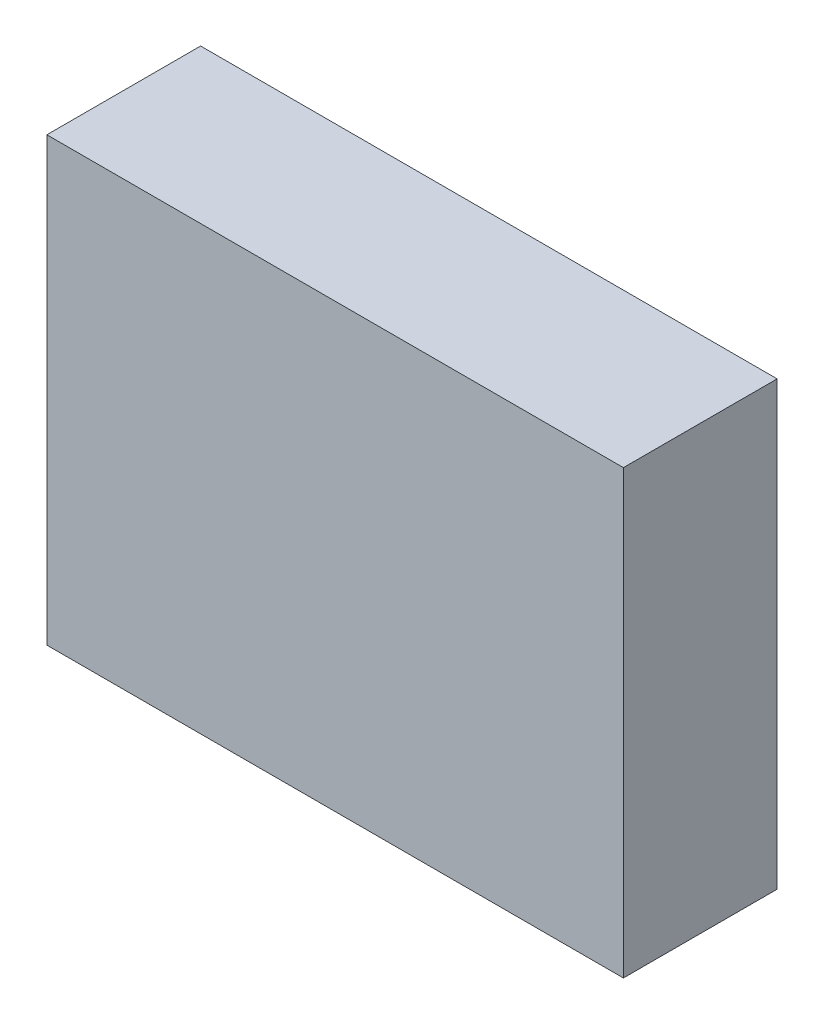
ISO-10303-21;
HEADER;
FILE_DESCRIPTION(('STEP AP214'),'2;1');
FILE_NAME('part.step','',(''),(''),'','','');
FILE_SCHEMA(('AUTOMOTIVE_DESIGN { 1 0 10303 214 1 1 1 1 }'));
ENDSEC;
DATA;
#1=APPLICATION_CONTEXT('core data for automotive mechanical design processes');
#2=APPLICATION_PROTOCOL_DEFINITION('international standard','automotive_design',2000,#1);
#3=PRODUCT_CONTEXT('',#1,'mechanical');
#4=PRODUCT('Part','Part','',(#3));
#5=PRODUCT_RELATED_PRODUCT_CATEGORY('part','',(#4));
#6=PRODUCT_DEFINITION_FORMATION('','',#4);
#7=PRODUCT_DEFINITION_CONTEXT('part definition',#1,'design');
#8=PRODUCT_DEFINITION('design','',#6,#7);
#9=PRODUCT_DEFINITION_SHAPE('','',#8);
#10=(LENGTH_UNIT() NAMED_UNIT(*) SI_UNIT(.MILLI.,.METRE.));
#11=(NAMED_UNIT(*) PLANE_ANGLE_UNIT() SI_UNIT($,.RADIAN.));
#12=(NAMED_UNIT(*) SI_UNIT($,.STERADIAN.) SOLID_ANGLE_UNIT());
#13=UNCERTAINTY_MEASURE_WITH_UNIT(LENGTH_MEASURE(1.E-05),#10,'distance_accuracy_value','');
#14=(GEOMETRIC_REPRESENTATION_CONTEXT(3) GLOBAL_UNCERTAINTY_ASSIGNED_CONTEXT((#13)) GLOBAL_UNIT_ASSIGNED_CONTEXT((#10,
#11,#12)) REPRESENTATION_CONTEXT('',''));
#15=CARTESIAN_POINT('',(0.,0.,0.));
#16=DIRECTION('',(0.,0.,1.));
#17=DIRECTION('',(1.,0.,0.));
#18=AXIS2_PLACEMENT_3D('',#15,#16,#17);
#19=CARTESIAN_POINT('',(0.,0.,80.));
#20=DIRECTION('',(1.,0.,0.));
#21=DIRECTION('',(0.,0.,-1.));
#22=AXIS2_PLACEMENT_3D('',#19,#20,#21);
#23=PLANE('',#22);
#24=DIRECTION('',(0.,-1.,0.));
#25=VECTOR('',#24,1.);
#26=CARTESIAN_POINT('',(0.,0.,0.));
#27=LINE('',#26,#25);
#28=CARTESIAN_POINT('',(0.,230.,0.));
#29=VERTEX_POINT('',#28);
#30=CARTESIAN_POINT('',(0.,0.,0.));
#31=VERTEX_POINT('',#30);
#32=EDGE_CURVE('E98',#29,#31,#27,.T.);
#33=ORIENTED_EDGE('',*,*,#32,.T.);
#34=DIRECTION('',(0.,0.,-1.));
#35=VECTOR('',#34,1.);
#36=CARTESIAN_POINT('',(0.,0.,80.));
#37=LINE('',#36,#35);
#38=CARTESIAN_POINT('',(0.,0.,80.));
#39=VERTEX_POINT('',#38);
#40=EDGE_CURVE('E11',#39,#31,#37,.T.);
#41=ORIENTED_EDGE('',*,*,#40,.F.);
#42=DIRECTION('',(0.,-1.,0.));
#43=VECTOR('',#42,1.);
#44=CARTESIAN_POINT('',(0.,0.,80.));
#45=LINE('',#44,#43);
#46=CARTESIAN_POINT('',(0.,230.,80.));
#47=VERTEX_POINT('',#46);
#48=EDGE_CURVE('E86',#47,#39,#45,.T.);
#49=ORIENTED_EDGE('',*,*,#48,.F.);
#50=DIRECTION('',(0.,0.,-1.));
#51=VECTOR('',#50,1.);
#52=CARTESIAN_POINT('',(0.,230.,80.));
#53=LINE('',#52,#51);
#54=EDGE_CURVE('E94',#47,#29,#53,.T.);
#55=ORIENTED_EDGE('',*,*,#54,.T.);
#56=EDGE_LOOP('',(#33,#41,#49,#55));
#57=FACE_BOUND('',#56,.T.);
#58=ADVANCED_FACE('F35',(#57),#23,.F.);
#59=CARTESIAN_POINT('',(0.,0.,80.));
#60=DIRECTION('',(0.,1.,0.));
#61=DIRECTION('',(0.,0.,1.));
#62=AXIS2_PLACEMENT_3D('',#59,#60,#61);
#63=PLANE('',#62);
#64=DIRECTION('',(1.,0.,0.));
#65=VECTOR('',#64,1.);
#66=CARTESIAN_POINT('',(0.,0.,0.));
#67=LINE('',#66,#65);
#68=CARTESIAN_POINT('',(300.,0.,0.));
#69=VERTEX_POINT('',#68);
#70=EDGE_CURVE('E90',#31,#69,#67,.T.);
#71=ORIENTED_EDGE('',*,*,#70,.T.);
#72=DIRECTION('',(0.,0.,-1.));
#73=VECTOR('',#72,1.);
#74=CARTESIAN_POINT('',(300.,0.,80.));
#75=LINE('',#74,#73);
#76=CARTESIAN_POINT('',(300.,0.,80.));
#77=VERTEX_POINT('',#76);
#78=EDGE_CURVE('E43',#77,#69,#75,.T.);
#79=ORIENTED_EDGE('',*,*,#78,.F.);
#80=DIRECTION('',(1.,0.,0.));
#81=VECTOR('',#80,1.);
#82=CARTESIAN_POINT('',(0.,0.,80.));
#83=LINE('',#82,#81);
#84=EDGE_CURVE('E81',#39,#77,#83,.T.);
#85=ORIENTED_EDGE('',*,*,#84,.F.);
#86=ORIENTED_EDGE('',*,*,#40,.T.);
#87=EDGE_LOOP('',(#71,#79,#85,#86));
#88=FACE_BOUND('',#87,.T.);
#89=ADVANCED_FACE('F89',(#88),#63,.F.);
#90=CARTESIAN_POINT('',(300.,0.,80.));
#91=DIRECTION('',(-1.,0.,0.));
#92=DIRECTION('',(0.,0.,1.));
#93=AXIS2_PLACEMENT_3D('',#90,#91,#92);
#94=PLANE('',#93);
#95=DIRECTION('',(0.,1.,0.));
#96=VECTOR('',#95,1.);
#97=CARTESIAN_POINT('',(300.,0.,0.));
#98=LINE('',#97,#96);
#99=CARTESIAN_POINT('',(300.,230.,0.));
#100=VERTEX_POINT('',#99);
#101=EDGE_CURVE('E68',#69,#100,#98,.T.);
#102=ORIENTED_EDGE('',*,*,#101,.T.);
#103=DIRECTION('',(0.,0.,-1.));
#104=VECTOR('',#103,1.);
#105=CARTESIAN_POINT('',(300.,230.,80.));
#106=LINE('',#105,#104);
#107=CARTESIAN_POINT('',(300.,230.,80.));
#108=VERTEX_POINT('',#107);
#109=EDGE_CURVE('E91',#108,#100,#106,.T.);
#110=ORIENTED_EDGE('',*,*,#109,.F.);
#111=DIRECTION('',(0.,1.,0.));
#112=VECTOR('',#111,1.);
#113=CARTESIAN_POINT('',(300.,0.,80.));
#114=LINE('',#113,#112);
#115=EDGE_CURVE('E84',#77,#108,#114,.T.);
#116=ORIENTED_EDGE('',*,*,#115,.F.);
#117=ORIENTED_EDGE('',*,*,#78,.T.);
#118=EDGE_LOOP('',(#102,#110,#116,#117));
#119=FACE_BOUND('',#118,.T.);
#120=ADVANCED_FACE('F92',(#119),#94,.F.);
#121=CARTESIAN_POINT('',(0.,230.,80.));
#122=DIRECTION('',(0.,-1.,0.));
#123=DIRECTION('',(0.,0.,-1.));
#124=AXIS2_PLACEMENT_3D('',#121,#122,#123);
#125=PLANE('',#124);
#126=DIRECTION('',(-1.,0.,0.));
#127=VECTOR('',#126,1.);
#128=CARTESIAN_POINT('',(0.,230.,0.));
#129=LINE('',#128,#127);
#130=EDGE_CURVE('E74',#100,#29,#129,.T.);
#131=ORIENTED_EDGE('',*,*,#130,.T.);
#132=ORIENTED_EDGE('',*,*,#54,.F.);
#133=DIRECTION('',(-1.,0.,0.));
#134=VECTOR('',#133,1.);
#135=CARTESIAN_POINT('',(0.,230.,80.));
#136=LINE('',#135,#134);
#137=EDGE_CURVE('E51',#108,#47,#136,.T.);
#138=ORIENTED_EDGE('',*,*,#137,.F.);
#139=ORIENTED_EDGE('',*,*,#109,.T.);
#140=EDGE_LOOP('',(#131,#132,#138,#139));
#141=FACE_BOUND('',#140,.T.);
#142=ADVANCED_FACE('F105',(#141),#125,.F.);
#143=CARTESIAN_POINT('',(0.,0.,80.));
#144=DIRECTION('',(0.,0.,-1.));
#145=DIRECTION('',(-1.,0.,0.));
#146=AXIS2_PLACEMENT_3D('',#143,#144,#145);
#147=PLANE('',#146);
#148=ORIENTED_EDGE('',*,*,#48,.T.);
#149=ORIENTED_EDGE('',*,*,#84,.T.);
#150=ORIENTED_EDGE('',*,*,#115,.T.);
#151=ORIENTED_EDGE('',*,*,#137,.T.);
#152=EDGE_LOOP('',(#148,#149,#150,#151));
#153=FACE_BOUND('',#152,.T.);
#154=ADVANCED_FACE('F82',(#153),#147,.F.);
#155=CARTESIAN_POINT('',(0.,0.,0.));
#156=DIRECTION('',(0.,0.,-1.));
#157=DIRECTION('',(-1.,0.,0.));
#158=AXIS2_PLACEMENT_3D('',#155,#156,#157);
#159=PLANE('',#158);
#160=ORIENTED_EDGE('',*,*,#32,.F.);
#161=ORIENTED_EDGE('',*,*,#130,.F.);
#162=ORIENTED_EDGE('',*,*,#101,.F.);
#163=ORIENTED_EDGE('',*,*,#70,.F.);
#164=EDGE_LOOP('',(#160,#161,#162,#163));
#165=FACE_BOUND('',#164,.T.);
#166=ADVANCED_FACE('F108',(#165),#159,.T.);
#167=CLOSED_SHELL('',(#58,#89,#120,#142,#154,#166));
#168=MANIFOLD_SOLID_BREP('B2',#167);
#169=ADVANCED_BREP_SHAPE_REPRESENTATION('',(#18,#168),#14);
#170=SHAPE_DEFINITION_REPRESENTATION(#9,#169);
ENDSEC;
END-ISO-10303-21;
